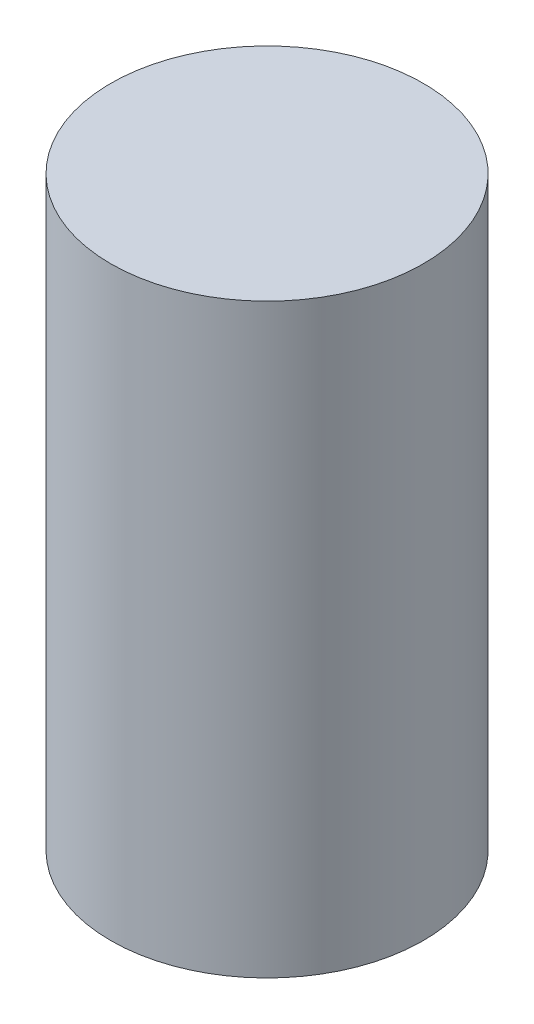
ISO-10303-21;
HEADER;
FILE_DESCRIPTION(('STEP AP214'),'2;1');
FILE_NAME('part.step','',(''),(''),'','','');
FILE_SCHEMA(('AUTOMOTIVE_DESIGN { 1 0 10303 214 1 1 1 1 }'));
ENDSEC;
DATA;
#1=APPLICATION_CONTEXT('core data for automotive mechanical design processes');
#2=APPLICATION_PROTOCOL_DEFINITION('international standard','automotive_design',2000,#1);
#3=PRODUCT_CONTEXT('',#1,'mechanical');
#4=PRODUCT('Part','Part','',(#3));
#5=PRODUCT_RELATED_PRODUCT_CATEGORY('part','',(#4));
#6=PRODUCT_DEFINITION_FORMATION('','',#4);
#7=PRODUCT_DEFINITION_CONTEXT('part definition',#1,'design');
#8=PRODUCT_DEFINITION('design','',#6,#7);
#9=PRODUCT_DEFINITION_SHAPE('','',#8);
#10=(LENGTH_UNIT() NAMED_UNIT(*) SI_UNIT(.MILLI.,.METRE.));
#11=(NAMED_UNIT(*) PLANE_ANGLE_UNIT() SI_UNIT($,.RADIAN.));
#12=(NAMED_UNIT(*) SI_UNIT($,.STERADIAN.) SOLID_ANGLE_UNIT());
#13=UNCERTAINTY_MEASURE_WITH_UNIT(LENGTH_MEASURE(1.E-05),#10,'distance_accuracy_value','');
#14=(GEOMETRIC_REPRESENTATION_CONTEXT(3) GLOBAL_UNCERTAINTY_ASSIGNED_CONTEXT((#13)) GLOBAL_UNIT_ASSIGNED_CONTEXT((#10,
#11,#12)) REPRESENTATION_CONTEXT('',''));
#15=CARTESIAN_POINT('',(0.,0.,0.));
#16=DIRECTION('',(0.,0.,1.));
#17=DIRECTION('',(1.,0.,0.));
#18=AXIS2_PLACEMENT_3D('',#15,#16,#17);
#19=CARTESIAN_POINT('',(0.,7.5,0.));
#20=DIRECTION('',(0.,-1.,0.));
#21=DIRECTION('',(0.,0.,-1.));
#22=AXIS2_PLACEMENT_3D('',#19,#20,#21);
#23=CYLINDRICAL_SURFACE('',#22,2.);
#24=CARTESIAN_POINT('',(0.,7.5,0.));
#25=DIRECTION('',(0.,1.,0.));
#26=DIRECTION('',(0.,0.,1.));
#27=AXIS2_PLACEMENT_3D('',#24,#25,#26);
#28=CIRCLE('',#27,2.);
#29=CARTESIAN_POINT('',(0.,7.5,2.));
#30=VERTEX_POINT('',#29);
#31=EDGE_CURVE('E10',#30,#30,#28,.T.);
#32=ORIENTED_EDGE('',*,*,#31,.F.);
#33=EDGE_LOOP('',(#32));
#34=FACE_BOUND('',#33,.T.);
#35=CARTESIAN_POINT('',(0.,0.,0.));
#36=DIRECTION('',(0.,1.,0.));
#37=DIRECTION('',(0.,0.,1.));
#38=AXIS2_PLACEMENT_3D('',#35,#36,#37);
#39=CIRCLE('',#38,2.);
#40=CARTESIAN_POINT('',(0.,0.,2.));
#41=VERTEX_POINT('',#40);
#42=EDGE_CURVE('E40',#41,#41,#39,.T.);
#43=ORIENTED_EDGE('',*,*,#42,.T.);
#44=EDGE_LOOP('',(#43));
#45=FACE_BOUND('',#44,.T.);
#46=ADVANCED_FACE('F37',(#34,#45),#23,.T.);
#47=CARTESIAN_POINT('',(0.,7.5,0.));
#48=DIRECTION('',(0.,1.,0.));
#49=DIRECTION('',(0.,0.,1.));
#50=AXIS2_PLACEMENT_3D('',#47,#48,#49);
#51=PLANE('',#50);
#52=ORIENTED_EDGE('',*,*,#31,.T.);
#53=EDGE_LOOP('',(#52));
#54=FACE_BOUND('',#53,.T.);
#55=ADVANCED_FACE('F54',(#54),#51,.T.);
#56=CARTESIAN_POINT('',(0.,0.,0.));
#57=DIRECTION('',(0.,1.,0.));
#58=DIRECTION('',(0.,0.,1.));
#59=AXIS2_PLACEMENT_3D('',#56,#57,#58);
#60=PLANE('',#59);
#61=ORIENTED_EDGE('',*,*,#42,.F.);
#62=EDGE_LOOP('',(#61));
#63=FACE_BOUND('',#62,.T.);
#64=ADVANCED_FACE('F52',(#63),#60,.F.);
#65=CLOSED_SHELL('',(#46,#55,#64));
#66=MANIFOLD_SOLID_BREP('B2',#65);
#67=ADVANCED_BREP_SHAPE_REPRESENTATION('',(#18,#66),#14);
#68=SHAPE_DEFINITION_REPRESENTATION(#9,#67);
ENDSEC;
END-ISO-10303-21;
